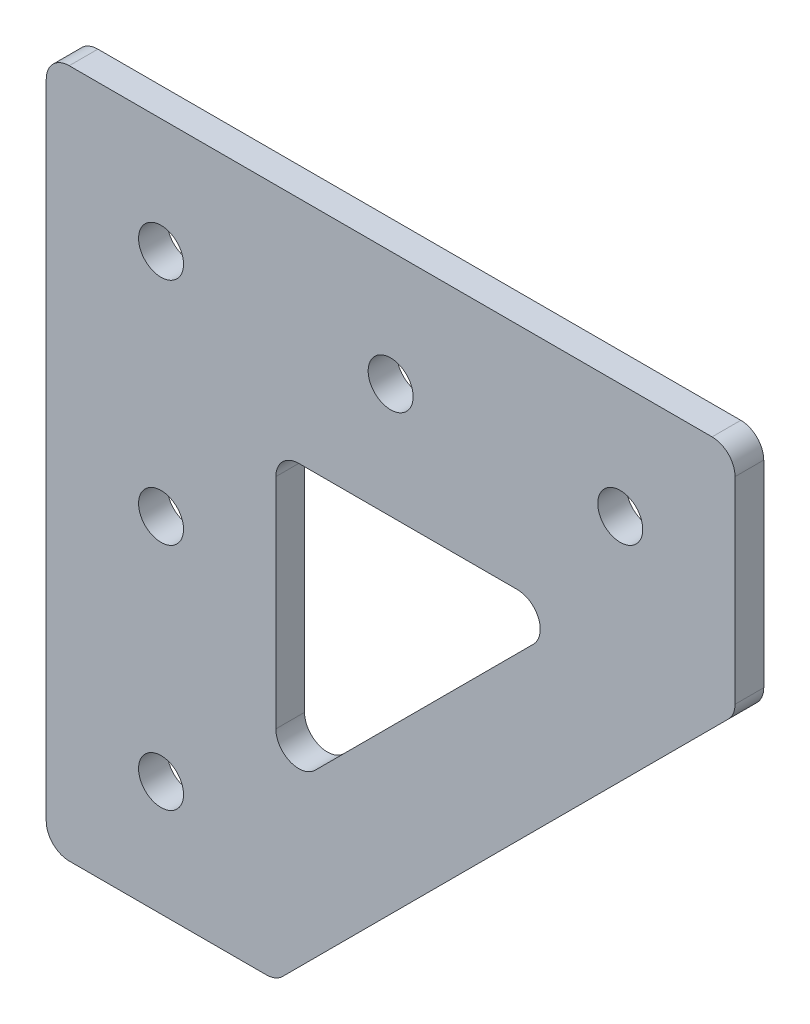
ISO-10303-21;
HEADER;
FILE_DESCRIPTION(('STEP AP214'),'2;1');
FILE_NAME('part.step','',(''),(''),'','','');
FILE_SCHEMA(('AUTOMOTIVE_DESIGN { 1 0 10303 214 1 1 1 1 }'));
ENDSEC;
DATA;
#1=APPLICATION_CONTEXT('core data for automotive mechanical design processes');
#2=APPLICATION_PROTOCOL_DEFINITION('international standard','automotive_design',2000,#1);
#3=PRODUCT_CONTEXT('',#1,'mechanical');
#4=PRODUCT('Part','Part','',(#3));
#5=PRODUCT_RELATED_PRODUCT_CATEGORY('part','',(#4));
#6=PRODUCT_DEFINITION_FORMATION('','',#4);
#7=PRODUCT_DEFINITION_CONTEXT('part definition',#1,'design');
#8=PRODUCT_DEFINITION('design','',#6,#7);
#9=PRODUCT_DEFINITION_SHAPE('','',#8);
#10=(LENGTH_UNIT() NAMED_UNIT(*) SI_UNIT(.MILLI.,.METRE.));
#11=(NAMED_UNIT(*) PLANE_ANGLE_UNIT() SI_UNIT($,.RADIAN.));
#12=(NAMED_UNIT(*) SI_UNIT($,.STERADIAN.) SOLID_ANGLE_UNIT());
#13=UNCERTAINTY_MEASURE_WITH_UNIT(LENGTH_MEASURE(1.E-05),#10,'distance_accuracy_value','');
#14=(GEOMETRIC_REPRESENTATION_CONTEXT(3) GLOBAL_UNCERTAINTY_ASSIGNED_CONTEXT((#13)) GLOBAL_UNIT_ASSIGNED_CONTEXT((#10,
#11,#12)) REPRESENTATION_CONTEXT('',''));
#15=CARTESIAN_POINT('',(0.,0.,0.));
#16=DIRECTION('',(0.,0.,1.));
#17=DIRECTION('',(1.,0.,0.));
#18=AXIS2_PLACEMENT_3D('',#15,#16,#17);
#19=CARTESIAN_POINT('',(0.,50.8,-3.175));
#20=DIRECTION('',(0.,1.,0.));
#21=DIRECTION('',(-1.,0.,0.));
#22=AXIS2_PLACEMENT_3D('',#19,#20,#21);
#23=PLANE('',#22);
#24=DIRECTION('',(-1.,0.,0.));
#25=VECTOR('',#24,1.);
#26=CARTESIAN_POINT('',(0.,50.8,-3.175));
#27=LINE('',#26,#25);
#28=CARTESIAN_POINT('',(52.107385309434,50.8,-3.175));
#29=VERTEX_POINT('',#28);
#30=CARTESIAN_POINT('',(27.94,50.8,-3.175));
#31=VERTEX_POINT('',#30);
#32=EDGE_CURVE('E172',#29,#31,#27,.T.);
#33=ORIENTED_EDGE('',*,*,#32,.F.);
#34=DIRECTION('',(0.,0.,1.));
#35=VECTOR('',#34,1.);
#36=CARTESIAN_POINT('',(52.107385309434,50.8,-3.175));
#37=LINE('',#36,#35);
#38=CARTESIAN_POINT('',(52.107385309434,50.8,0.));
#39=VERTEX_POINT('',#38);
#40=EDGE_CURVE('E157',#29,#39,#37,.T.);
#41=ORIENTED_EDGE('',*,*,#40,.T.);
#42=DIRECTION('',(-1.,0.,0.));
#43=VECTOR('',#42,1.);
#44=CARTESIAN_POINT('',(0.,50.8,0.));
#45=LINE('',#44,#43);
#46=CARTESIAN_POINT('',(27.94,50.8,0.));
#47=VERTEX_POINT('',#46);
#48=EDGE_CURVE('E169',#39,#47,#45,.T.);
#49=ORIENTED_EDGE('',*,*,#48,.T.);
#50=DIRECTION('',(0.,0.,1.));
#51=VECTOR('',#50,1.);
#52=CARTESIAN_POINT('',(27.94,50.8,-3.175));
#53=LINE('',#52,#51);
#54=EDGE_CURVE('E174',#47,#31,#53,.F.);
#55=ORIENTED_EDGE('',*,*,#54,.T.);
#56=EDGE_LOOP('',(#33,#41,#49,#55));
#57=FACE_BOUND('',#56,.T.);
#58=ADVANCED_FACE('F39',(#57),#23,.F.);
#59=CARTESIAN_POINT('',(25.4,0.,-3.175));
#60=DIRECTION('',(-1.,0.,0.));
#61=DIRECTION('',(0.,-1.,0.));
#62=AXIS2_PLACEMENT_3D('',#59,#60,#61);
#63=PLANE('',#62);
#64=DIRECTION('',(0.,-1.,0.));
#65=VECTOR('',#64,1.);
#66=CARTESIAN_POINT('',(25.4,0.,0.));
#67=LINE('',#66,#65);
#68=CARTESIAN_POINT('',(25.4,48.26,0.));
#69=VERTEX_POINT('',#68);
#70=CARTESIAN_POINT('',(25.4,24.092614690566,0.));
#71=VERTEX_POINT('',#70);
#72=EDGE_CURVE('E181',#69,#71,#67,.T.);
#73=ORIENTED_EDGE('',*,*,#72,.T.);
#74=DIRECTION('',(0.,0.,1.));
#75=VECTOR('',#74,1.);
#76=CARTESIAN_POINT('',(25.4,24.092614690566,-3.175));
#77=LINE('',#76,#75);
#78=CARTESIAN_POINT('',(25.4,24.092614690566,-3.175));
#79=VERTEX_POINT('',#78);
#80=EDGE_CURVE('E199',#71,#79,#77,.F.);
#81=ORIENTED_EDGE('',*,*,#80,.T.);
#82=DIRECTION('',(0.,-1.,0.));
#83=VECTOR('',#82,1.);
#84=CARTESIAN_POINT('',(25.4,0.,-3.175));
#85=LINE('',#84,#83);
#86=CARTESIAN_POINT('',(25.4,48.26,-3.175));
#87=VERTEX_POINT('',#86);
#88=EDGE_CURVE('E191',#87,#79,#85,.T.);
#89=ORIENTED_EDGE('',*,*,#88,.F.);
#90=DIRECTION('',(0.,0.,1.));
#91=VECTOR('',#90,1.);
#92=CARTESIAN_POINT('',(25.4,48.26,0.));
#93=LINE('',#92,#91);
#94=EDGE_CURVE('E196',#87,#69,#93,.T.);
#95=ORIENTED_EDGE('',*,*,#94,.T.);
#96=EDGE_LOOP('',(#73,#81,#89,#95));
#97=FACE_BOUND('',#96,.T.);
#98=ADVANCED_FACE('F263',(#97),#63,.F.);
#99=CARTESIAN_POINT('',(0.,0.,-3.175));
#100=DIRECTION('',(0.,1.,0.));
#101=DIRECTION('',(-1.,0.,0.));
#102=AXIS2_PLACEMENT_3D('',#99,#100,#101);
#103=PLANE('',#102);
#104=DIRECTION('',(-1.,0.,0.));
#105=VECTOR('',#104,1.);
#106=CARTESIAN_POINT('',(0.,0.,-3.175));
#107=LINE('',#106,#105);
#108=CARTESIAN_POINT('',(24.3478975515723,0.,-3.175));
#109=VERTEX_POINT('',#108);
#110=CARTESIAN_POINT('',(2.54,0.,-3.175));
#111=VERTEX_POINT('',#110);
#112=EDGE_CURVE('E190',#109,#111,#107,.T.);
#113=ORIENTED_EDGE('',*,*,#112,.F.);
#114=DIRECTION('',(0.,0.,1.));
#115=VECTOR('',#114,1.);
#116=CARTESIAN_POINT('',(24.3478975515723,0.,0.));
#117=LINE('',#116,#115);
#118=CARTESIAN_POINT('',(24.3478975515723,0.,0.));
#119=VERTEX_POINT('',#118);
#120=EDGE_CURVE('E203',#109,#119,#117,.T.);
#121=ORIENTED_EDGE('',*,*,#120,.T.);
#122=DIRECTION('',(-1.,0.,0.));
#123=VECTOR('',#122,1.);
#124=CARTESIAN_POINT('',(0.,0.,0.));
#125=LINE('',#124,#123);
#126=CARTESIAN_POINT('',(2.54,0.,0.));
#127=VERTEX_POINT('',#126);
#128=EDGE_CURVE('E276',#119,#127,#125,.T.);
#129=ORIENTED_EDGE('',*,*,#128,.T.);
#130=DIRECTION('',(0.,0.,1.));
#131=VECTOR('',#130,1.);
#132=CARTESIAN_POINT('',(2.54,0.,-3.175));
#133=LINE('',#132,#131);
#134=EDGE_CURVE('E201',#127,#111,#133,.F.);
#135=ORIENTED_EDGE('',*,*,#134,.T.);
#136=EDGE_LOOP('',(#113,#121,#129,#135));
#137=FACE_BOUND('',#136,.T.);
#138=ADVANCED_FACE('F330',(#137),#103,.F.);
#139=CARTESIAN_POINT('',(0.,0.,-3.175));
#140=DIRECTION('',(1.,0.,0.));
#141=DIRECTION('',(0.,0.,-1.));
#142=AXIS2_PLACEMENT_3D('',#139,#140,#141);
#143=PLANE('',#142);
#144=DIRECTION('',(0.,1.,0.));
#145=VECTOR('',#144,1.);
#146=CARTESIAN_POINT('',(0.,0.,-3.175));
#147=LINE('',#146,#145);
#148=CARTESIAN_POINT('',(0.,2.54,-3.175));
#149=VERTEX_POINT('',#148);
#150=CARTESIAN_POINT('',(0.,73.66,-3.175));
#151=VERTEX_POINT('',#150);
#152=EDGE_CURVE('E268',#149,#151,#147,.T.);
#153=ORIENTED_EDGE('',*,*,#152,.F.);
#154=DIRECTION('',(0.,0.,1.));
#155=VECTOR('',#154,1.);
#156=CARTESIAN_POINT('',(0.,2.54,-3.175));
#157=LINE('',#156,#155);
#158=CARTESIAN_POINT('',(0.,2.54,0.));
#159=VERTEX_POINT('',#158);
#160=EDGE_CURVE('E164',#149,#159,#157,.T.);
#161=ORIENTED_EDGE('',*,*,#160,.T.);
#162=DIRECTION('',(0.,1.,0.));
#163=VECTOR('',#162,1.);
#164=CARTESIAN_POINT('',(0.,0.,0.));
#165=LINE('',#164,#163);
#166=CARTESIAN_POINT('',(0.,73.66,0.));
#167=VERTEX_POINT('',#166);
#168=EDGE_CURVE('E179',#159,#167,#165,.T.);
#169=ORIENTED_EDGE('',*,*,#168,.T.);
#170=DIRECTION('',(0.,0.,1.));
#171=VECTOR('',#170,1.);
#172=CARTESIAN_POINT('',(0.,73.66,-3.175));
#173=LINE('',#172,#171);
#174=EDGE_CURVE('E239',#167,#151,#173,.F.);
#175=ORIENTED_EDGE('',*,*,#174,.T.);
#176=EDGE_LOOP('',(#153,#161,#169,#175));
#177=FACE_BOUND('',#176,.T.);
#178=ADVANCED_FACE('F322',(#177),#143,.F.);
#179=CARTESIAN_POINT('',(0.,76.2,-3.175));
#180=DIRECTION('',(0.,-1.,0.));
#181=DIRECTION('',(0.,0.,-1.));
#182=AXIS2_PLACEMENT_3D('',#179,#180,#181);
#183=PLANE('',#182);
#184=DIRECTION('',(1.,0.,0.));
#185=VECTOR('',#184,1.);
#186=CARTESIAN_POINT('',(0.,76.2,0.));
#187=LINE('',#186,#185);
#188=CARTESIAN_POINT('',(2.54,76.2,0.));
#189=VERTEX_POINT('',#188);
#190=CARTESIAN_POINT('',(73.66,76.2,0.));
#191=VERTEX_POINT('',#190);
#192=EDGE_CURVE('E184',#189,#191,#187,.T.);
#193=ORIENTED_EDGE('',*,*,#192,.T.);
#194=DIRECTION('',(0.,0.,1.));
#195=VECTOR('',#194,1.);
#196=CARTESIAN_POINT('',(73.66,76.2,-3.175));
#197=LINE('',#196,#195);
#198=CARTESIAN_POINT('',(73.66,76.2,-3.175));
#199=VERTEX_POINT('',#198);
#200=EDGE_CURVE('E237',#191,#199,#197,.F.);
#201=ORIENTED_EDGE('',*,*,#200,.T.);
#202=DIRECTION('',(1.,0.,0.));
#203=VECTOR('',#202,1.);
#204=CARTESIAN_POINT('',(0.,76.2,-3.175));
#205=LINE('',#204,#203);
#206=CARTESIAN_POINT('',(2.54,76.2,-3.175));
#207=VERTEX_POINT('',#206);
#208=EDGE_CURVE('E271',#207,#199,#205,.T.);
#209=ORIENTED_EDGE('',*,*,#208,.F.);
#210=DIRECTION('',(0.,0.,1.));
#211=VECTOR('',#210,1.);
#212=CARTESIAN_POINT('',(2.54,76.2,-3.175));
#213=LINE('',#212,#211);
#214=EDGE_CURVE('E234',#207,#189,#213,.T.);
#215=ORIENTED_EDGE('',*,*,#214,.T.);
#216=EDGE_LOOP('',(#193,#201,#209,#215));
#217=FACE_BOUND('',#216,.T.);
#218=ADVANCED_FACE('F288',(#217),#183,.F.);
#219=CARTESIAN_POINT('',(76.2,0.,-3.175));
#220=DIRECTION('',(-1.,0.,0.));
#221=DIRECTION('',(0.,0.,1.));
#222=AXIS2_PLACEMENT_3D('',#219,#220,#221);
#223=PLANE('',#222);
#224=DIRECTION('',(0.,-1.,0.));
#225=VECTOR('',#224,1.);
#226=CARTESIAN_POINT('',(76.2,0.,0.));
#227=LINE('',#226,#225);
#228=CARTESIAN_POINT('',(76.2,73.66,0.));
#229=VERTEX_POINT('',#228);
#230=CARTESIAN_POINT('',(76.2,51.8521024484277,0.));
#231=VERTEX_POINT('',#230);
#232=EDGE_CURVE('E283',#229,#231,#227,.T.);
#233=ORIENTED_EDGE('',*,*,#232,.T.);
#234=DIRECTION('',(0.,0.,1.));
#235=VECTOR('',#234,1.);
#236=CARTESIAN_POINT('',(76.2,51.8521024484277,-3.175));
#237=LINE('',#236,#235);
#238=CARTESIAN_POINT('',(76.2,51.8521024484277,-3.175));
#239=VERTEX_POINT('',#238);
#240=EDGE_CURVE('E54',#231,#239,#237,.F.);
#241=ORIENTED_EDGE('',*,*,#240,.T.);
#242=DIRECTION('',(0.,-1.,0.));
#243=VECTOR('',#242,1.);
#244=CARTESIAN_POINT('',(76.2,0.,-3.175));
#245=LINE('',#244,#243);
#246=CARTESIAN_POINT('',(76.2,73.66,-3.175));
#247=VERTEX_POINT('',#246);
#248=EDGE_CURVE('E297',#247,#239,#245,.T.);
#249=ORIENTED_EDGE('',*,*,#248,.F.);
#250=DIRECTION('',(0.,0.,1.));
#251=VECTOR('',#250,1.);
#252=CARTESIAN_POINT('',(76.2,73.66,-3.175));
#253=LINE('',#252,#251);
#254=EDGE_CURVE('E230',#247,#229,#253,.T.);
#255=ORIENTED_EDGE('',*,*,#254,.T.);
#256=EDGE_LOOP('',(#233,#241,#249,#255));
#257=FACE_BOUND('',#256,.T.);
#258=ADVANCED_FACE('F296',(#257),#223,.F.);
#259=CARTESIAN_POINT('',(12.7,-12.7,-3.175));
#260=DIRECTION('',(0.707106781186548,-0.707106781186548,0.));
#261=DIRECTION('',(0.707106781186548,0.707106781186548,0.));
#262=AXIS2_PLACEMENT_3D('',#259,#260,#261);
#263=PLANE('',#262);
#264=DIRECTION('',(0.707106781186548,0.707106781186548,0.));
#265=VECTOR('',#264,1.);
#266=CARTESIAN_POINT('',(12.7,-12.7,0.));
#267=LINE('',#266,#265);
#268=CARTESIAN_POINT('',(26.1439487757862,0.743948775786171,0.));
#269=VERTEX_POINT('',#268);
#270=CARTESIAN_POINT('',(75.4560512242138,50.0560512242138,0.));
#271=VERTEX_POINT('',#270);
#272=EDGE_CURVE('E279',#269,#271,#267,.T.);
#273=ORIENTED_EDGE('',*,*,#272,.F.);
#274=DIRECTION('',(0.,0.,1.));
#275=VECTOR('',#274,1.);
#276=CARTESIAN_POINT('',(26.1439487757862,0.743948775786169,-3.175));
#277=LINE('',#276,#275);
#278=CARTESIAN_POINT('',(26.1439487757862,0.743948775786171,-3.175));
#279=VERTEX_POINT('',#278);
#280=EDGE_CURVE('E219',#269,#279,#277,.F.);
#281=ORIENTED_EDGE('',*,*,#280,.T.);
#282=DIRECTION('',(0.707106781186548,0.707106781186548,0.));
#283=VECTOR('',#282,1.);
#284=CARTESIAN_POINT('',(12.7,-12.7,-3.175));
#285=LINE('',#284,#283);
#286=CARTESIAN_POINT('',(75.4560512242138,50.0560512242138,-3.175));
#287=VERTEX_POINT('',#286);
#288=EDGE_CURVE('E309',#279,#287,#285,.T.);
#289=ORIENTED_EDGE('',*,*,#288,.T.);
#290=DIRECTION('',(0.,0.,1.));
#291=VECTOR('',#290,1.);
#292=CARTESIAN_POINT('',(75.4560512242138,50.0560512242138,0.));
#293=LINE('',#292,#291);
#294=EDGE_CURVE('E216',#287,#271,#293,.T.);
#295=ORIENTED_EDGE('',*,*,#294,.T.);
#296=EDGE_LOOP('',(#273,#281,#289,#295));
#297=FACE_BOUND('',#296,.T.);
#298=ADVANCED_FACE('F306',(#297),#263,.T.);
#299=CARTESIAN_POINT('',(3.71974387893086,-3.71974387893086,-3.175));
#300=DIRECTION('',(-0.707106781186548,0.707106781186547,0.));
#301=DIRECTION('',(-0.707106781186547,-0.707106781186548,0.));
#302=AXIS2_PLACEMENT_3D('',#299,#300,#301);
#303=PLANE('',#302);
#304=DIRECTION('',(-0.707106781186547,-0.707106781186548,0.));
#305=VECTOR('',#304,1.);
#306=CARTESIAN_POINT('',(3.71974387893086,-3.71974387893086,0.));
#307=LINE('',#306,#305);
#308=CARTESIAN_POINT('',(53.9034365336479,46.4639487757862,0.));
#309=VERTEX_POINT('',#308);
#310=CARTESIAN_POINT('',(29.7360512242138,22.2965634663521,0.));
#311=VERTEX_POINT('',#310);
#312=EDGE_CURVE('E178',#309,#311,#307,.T.);
#313=ORIENTED_EDGE('',*,*,#312,.F.);
#314=DIRECTION('',(0.,0.,1.));
#315=VECTOR('',#314,1.);
#316=CARTESIAN_POINT('',(53.9034365336479,46.4639487757862,-3.175));
#317=LINE('',#316,#315);
#318=CARTESIAN_POINT('',(53.9034365336479,46.4639487757862,-3.175));
#319=VERTEX_POINT('',#318);
#320=EDGE_CURVE('E158',#309,#319,#317,.F.);
#321=ORIENTED_EDGE('',*,*,#320,.T.);
#322=DIRECTION('',(-0.707106781186547,-0.707106781186548,0.));
#323=VECTOR('',#322,1.);
#324=CARTESIAN_POINT('',(3.71974387893086,-3.71974387893086,-3.175));
#325=LINE('',#324,#323);
#326=CARTESIAN_POINT('',(29.7360512242138,22.2965634663521,-3.175));
#327=VERTEX_POINT('',#326);
#328=EDGE_CURVE('E253',#319,#327,#325,.T.);
#329=ORIENTED_EDGE('',*,*,#328,.T.);
#330=DIRECTION('',(0.,0.,1.));
#331=VECTOR('',#330,1.);
#332=CARTESIAN_POINT('',(29.7360512242138,22.2965634663521,-3.175));
#333=LINE('',#332,#331);
#334=EDGE_CURVE('E173',#327,#311,#333,.T.);
#335=ORIENTED_EDGE('',*,*,#334,.T.);
#336=EDGE_LOOP('',(#313,#321,#329,#335));
#337=FACE_BOUND('',#336,.T.);
#338=ADVANCED_FACE('F259',(#337),#303,.T.);
#339=CARTESIAN_POINT('',(0.,0.,-3.175));
#340=DIRECTION('',(0.,0.,1.));
#341=DIRECTION('',(1.,0.,0.));
#342=AXIS2_PLACEMENT_3D('',#339,#340,#341);
#343=PLANE('',#342);
#344=CARTESIAN_POINT('',(12.7,12.7,-3.175));
#345=DIRECTION('',(0.,0.,1.));
#346=DIRECTION('',(1.,0.,0.));
#347=AXIS2_PLACEMENT_3D('',#344,#345,#346);
#348=CIRCLE('',#347,2.4892);
#349=CARTESIAN_POINT('',(15.1892,12.7,-3.175));
#350=VERTEX_POINT('',#349);
#351=EDGE_CURVE('E526',#350,#350,#348,.T.);
#352=ORIENTED_EDGE('',*,*,#351,.T.);
#353=EDGE_LOOP('',(#352));
#354=FACE_BOUND('',#353,.T.);
#355=CARTESIAN_POINT('',(12.7,38.1,-3.175));
#356=DIRECTION('',(0.,0.,1.));
#357=DIRECTION('',(1.,0.,0.));
#358=AXIS2_PLACEMENT_3D('',#355,#356,#357);
#359=CIRCLE('',#358,2.4892);
#360=CARTESIAN_POINT('',(15.1892,38.1,-3.175));
#361=VERTEX_POINT('',#360);
#362=EDGE_CURVE('E530',#361,#361,#359,.T.);
#363=ORIENTED_EDGE('',*,*,#362,.T.);
#364=EDGE_LOOP('',(#363));
#365=FACE_BOUND('',#364,.T.);
#366=CARTESIAN_POINT('',(63.5,63.5,-3.175));
#367=DIRECTION('',(0.,0.,1.));
#368=DIRECTION('',(1.,0.,0.));
#369=AXIS2_PLACEMENT_3D('',#366,#367,#368);
#370=CIRCLE('',#369,2.4892);
#371=CARTESIAN_POINT('',(65.9892,63.5,-3.175));
#372=VERTEX_POINT('',#371);
#373=EDGE_CURVE('E534',#372,#372,#370,.T.);
#374=ORIENTED_EDGE('',*,*,#373,.T.);
#375=EDGE_LOOP('',(#374));
#376=FACE_BOUND('',#375,.T.);
#377=CARTESIAN_POINT('',(38.1,63.5,-3.175));
#378=DIRECTION('',(0.,0.,1.));
#379=DIRECTION('',(1.,0.,0.));
#380=AXIS2_PLACEMENT_3D('',#377,#378,#379);
#381=CIRCLE('',#380,2.4892);
#382=CARTESIAN_POINT('',(40.5892,63.5,-3.175));
#383=VERTEX_POINT('',#382);
#384=EDGE_CURVE('E538',#383,#383,#381,.T.);
#385=ORIENTED_EDGE('',*,*,#384,.T.);
#386=EDGE_LOOP('',(#385));
#387=FACE_BOUND('',#386,.T.);
#388=CARTESIAN_POINT('',(12.7,63.5,-3.175));
#389=DIRECTION('',(0.,0.,1.));
#390=DIRECTION('',(1.,0.,0.));
#391=AXIS2_PLACEMENT_3D('',#388,#389,#390);
#392=CIRCLE('',#391,2.4892);
#393=CARTESIAN_POINT('',(15.1892,63.5,-3.175));
#394=VERTEX_POINT('',#393);
#395=EDGE_CURVE('E280',#394,#394,#392,.T.);
#396=ORIENTED_EDGE('',*,*,#395,.T.);
#397=EDGE_LOOP('',(#396));
#398=FACE_BOUND('',#397,.T.);
#399=ORIENTED_EDGE('',*,*,#288,.F.);
#400=CARTESIAN_POINT('',(24.3478975515723,2.54,-3.175));
#401=DIRECTION('',(0.,0.,1.));
#402=DIRECTION('',(1.,0.,0.));
#403=AXIS2_PLACEMENT_3D('',#400,#401,#402);
#404=CIRCLE('',#403,2.54);
#405=EDGE_CURVE('E228',#279,#109,#404,.F.);
#406=ORIENTED_EDGE('',*,*,#405,.T.);
#407=ORIENTED_EDGE('',*,*,#112,.T.);
#408=CARTESIAN_POINT('',(2.54,2.54,-3.175));
#409=DIRECTION('',(0.,0.,1.));
#410=DIRECTION('',(1.,0.,0.));
#411=AXIS2_PLACEMENT_3D('',#408,#409,#410);
#412=CIRCLE('',#411,2.54);
#413=EDGE_CURVE('E223',#111,#149,#412,.F.);
#414=ORIENTED_EDGE('',*,*,#413,.T.);
#415=ORIENTED_EDGE('',*,*,#152,.T.);
#416=CARTESIAN_POINT('',(2.54,73.66,-3.175));
#417=DIRECTION('',(0.,0.,1.));
#418=DIRECTION('',(1.,0.,0.));
#419=AXIS2_PLACEMENT_3D('',#416,#417,#418);
#420=CIRCLE('',#419,2.54);
#421=EDGE_CURVE('E221',#151,#207,#420,.F.);
#422=ORIENTED_EDGE('',*,*,#421,.T.);
#423=ORIENTED_EDGE('',*,*,#208,.T.);
#424=CARTESIAN_POINT('',(73.66,73.66,-3.175));
#425=DIRECTION('',(0.,0.,1.));
#426=DIRECTION('',(1.,0.,0.));
#427=AXIS2_PLACEMENT_3D('',#424,#425,#426);
#428=CIRCLE('',#427,2.54);
#429=EDGE_CURVE('E61',#199,#247,#428,.F.);
#430=ORIENTED_EDGE('',*,*,#429,.T.);
#431=ORIENTED_EDGE('',*,*,#248,.T.);
#432=CARTESIAN_POINT('',(73.66,51.8521024484277,-3.175));
#433=DIRECTION('',(0.,0.,1.));
#434=DIRECTION('',(1.,0.,0.));
#435=AXIS2_PLACEMENT_3D('',#432,#433,#434);
#436=CIRCLE('',#435,2.54);
#437=EDGE_CURVE('E226',#239,#287,#436,.F.);
#438=ORIENTED_EDGE('',*,*,#437,.T.);
#439=EDGE_LOOP('',(#399,#406,#407,#414,#415,#422,#423,#430,#431,#438));
#440=FACE_BOUND('',#439,.T.);
#441=ORIENTED_EDGE('',*,*,#328,.F.);
#442=CARTESIAN_POINT('',(52.107385309434,48.26,-3.175));
#443=DIRECTION('',(0.,0.,1.));
#444=DIRECTION('',(1.,0.,0.));
#445=AXIS2_PLACEMENT_3D('',#442,#443,#444);
#446=CIRCLE('',#445,2.54);
#447=EDGE_CURVE('E163',#319,#29,#446,.T.);
#448=ORIENTED_EDGE('',*,*,#447,.T.);
#449=ORIENTED_EDGE('',*,*,#32,.T.);
#450=CARTESIAN_POINT('',(27.94,48.26,-3.175));
#451=DIRECTION('',(0.,0.,1.));
#452=DIRECTION('',(1.,0.,0.));
#453=AXIS2_PLACEMENT_3D('',#450,#451,#452);
#454=CIRCLE('',#453,2.54);
#455=EDGE_CURVE('E11',#31,#87,#454,.T.);
#456=ORIENTED_EDGE('',*,*,#455,.T.);
#457=ORIENTED_EDGE('',*,*,#88,.T.);
#458=CARTESIAN_POINT('',(27.94,24.092614690566,-3.175));
#459=DIRECTION('',(0.,0.,1.));
#460=DIRECTION('',(1.,0.,0.));
#461=AXIS2_PLACEMENT_3D('',#458,#459,#460);
#462=CIRCLE('',#461,2.54);
#463=EDGE_CURVE('E246',#79,#327,#462,.T.);
#464=ORIENTED_EDGE('',*,*,#463,.T.);
#465=EDGE_LOOP('',(#441,#448,#449,#456,#457,#464));
#466=FACE_BOUND('',#465,.T.);
#467=ADVANCED_FACE('F252',(#354,#365,#376,#387,#398,#440,#466),#343,.F.);
#468=CARTESIAN_POINT('',(0.,0.,0.));
#469=DIRECTION('',(0.,0.,1.));
#470=DIRECTION('',(1.,0.,0.));
#471=AXIS2_PLACEMENT_3D('',#468,#469,#470);
#472=PLANE('',#471);
#473=CARTESIAN_POINT('',(12.7,12.7,0.));
#474=DIRECTION('',(0.,0.,1.));
#475=DIRECTION('',(1.,0.,0.));
#476=AXIS2_PLACEMENT_3D('',#473,#474,#475);
#477=CIRCLE('',#476,2.4892);
#478=CARTESIAN_POINT('',(15.1892,12.7,0.));
#479=VERTEX_POINT('',#478);
#480=EDGE_CURVE('E547',#479,#479,#477,.T.);
#481=ORIENTED_EDGE('',*,*,#480,.F.);
#482=EDGE_LOOP('',(#481));
#483=FACE_BOUND('',#482,.T.);
#484=CARTESIAN_POINT('',(12.7,38.1,0.));
#485=DIRECTION('',(0.,0.,1.));
#486=DIRECTION('',(1.,0.,0.));
#487=AXIS2_PLACEMENT_3D('',#484,#485,#486);
#488=CIRCLE('',#487,2.4892);
#489=CARTESIAN_POINT('',(15.1892,38.1,0.));
#490=VERTEX_POINT('',#489);
#491=EDGE_CURVE('E551',#490,#490,#488,.T.);
#492=ORIENTED_EDGE('',*,*,#491,.F.);
#493=EDGE_LOOP('',(#492));
#494=FACE_BOUND('',#493,.T.);
#495=CARTESIAN_POINT('',(63.5,63.5,0.));
#496=DIRECTION('',(0.,0.,1.));
#497=DIRECTION('',(1.,0.,0.));
#498=AXIS2_PLACEMENT_3D('',#495,#496,#497);
#499=CIRCLE('',#498,2.4892);
#500=CARTESIAN_POINT('',(65.9892,63.5,0.));
#501=VERTEX_POINT('',#500);
#502=EDGE_CURVE('E555',#501,#501,#499,.T.);
#503=ORIENTED_EDGE('',*,*,#502,.F.);
#504=EDGE_LOOP('',(#503));
#505=FACE_BOUND('',#504,.T.);
#506=CARTESIAN_POINT('',(38.1,63.5,0.));
#507=DIRECTION('',(0.,0.,1.));
#508=DIRECTION('',(1.,0.,0.));
#509=AXIS2_PLACEMENT_3D('',#506,#507,#508);
#510=CIRCLE('',#509,2.4892);
#511=CARTESIAN_POINT('',(40.5892,63.5,0.));
#512=VERTEX_POINT('',#511);
#513=EDGE_CURVE('E544',#512,#512,#510,.T.);
#514=ORIENTED_EDGE('',*,*,#513,.F.);
#515=EDGE_LOOP('',(#514));
#516=FACE_BOUND('',#515,.T.);
#517=CARTESIAN_POINT('',(12.7,63.5,0.));
#518=DIRECTION('',(0.,0.,1.));
#519=DIRECTION('',(1.,0.,0.));
#520=AXIS2_PLACEMENT_3D('',#517,#518,#519);
#521=CIRCLE('',#520,2.4892);
#522=CARTESIAN_POINT('',(15.1892,63.5,0.));
#523=VERTEX_POINT('',#522);
#524=EDGE_CURVE('E541',#523,#523,#521,.T.);
#525=ORIENTED_EDGE('',*,*,#524,.F.);
#526=EDGE_LOOP('',(#525));
#527=FACE_BOUND('',#526,.T.);
#528=ORIENTED_EDGE('',*,*,#128,.F.);
#529=CARTESIAN_POINT('',(24.3478975515723,2.54,0.));
#530=DIRECTION('',(0.,0.,1.));
#531=DIRECTION('',(1.,0.,0.));
#532=AXIS2_PLACEMENT_3D('',#529,#530,#531);
#533=CIRCLE('',#532,2.54);
#534=EDGE_CURVE('E214',#119,#269,#533,.T.);
#535=ORIENTED_EDGE('',*,*,#534,.T.);
#536=ORIENTED_EDGE('',*,*,#272,.T.);
#537=CARTESIAN_POINT('',(73.66,51.8521024484277,0.));
#538=DIRECTION('',(0.,0.,1.));
#539=DIRECTION('',(1.,0.,0.));
#540=AXIS2_PLACEMENT_3D('',#537,#538,#539);
#541=CIRCLE('',#540,2.54);
#542=EDGE_CURVE('E212',#271,#231,#541,.T.);
#543=ORIENTED_EDGE('',*,*,#542,.T.);
#544=ORIENTED_EDGE('',*,*,#232,.F.);
#545=CARTESIAN_POINT('',(73.66,73.66,0.));
#546=DIRECTION('',(0.,0.,1.));
#547=DIRECTION('',(1.,0.,0.));
#548=AXIS2_PLACEMENT_3D('',#545,#546,#547);
#549=CIRCLE('',#548,2.54);
#550=EDGE_CURVE('E210',#229,#191,#549,.T.);
#551=ORIENTED_EDGE('',*,*,#550,.T.);
#552=ORIENTED_EDGE('',*,*,#192,.F.);
#553=CARTESIAN_POINT('',(2.54,73.66,0.));
#554=DIRECTION('',(0.,0.,1.));
#555=DIRECTION('',(1.,0.,0.));
#556=AXIS2_PLACEMENT_3D('',#553,#554,#555);
#557=CIRCLE('',#556,2.54);
#558=EDGE_CURVE('E206',#189,#167,#557,.T.);
#559=ORIENTED_EDGE('',*,*,#558,.T.);
#560=ORIENTED_EDGE('',*,*,#168,.F.);
#561=CARTESIAN_POINT('',(2.54,2.54,0.));
#562=DIRECTION('',(0.,0.,1.));
#563=DIRECTION('',(1.,0.,0.));
#564=AXIS2_PLACEMENT_3D('',#561,#562,#563);
#565=CIRCLE('',#564,2.54);
#566=EDGE_CURVE('E208',#159,#127,#565,.T.);
#567=ORIENTED_EDGE('',*,*,#566,.T.);
#568=EDGE_LOOP('',(#528,#535,#536,#543,#544,#551,#552,#559,#560,#567));
#569=FACE_BOUND('',#568,.T.);
#570=ORIENTED_EDGE('',*,*,#48,.F.);
#571=CARTESIAN_POINT('',(52.107385309434,48.26,0.));
#572=DIRECTION('',(0.,0.,1.));
#573=DIRECTION('',(1.,0.,0.));
#574=AXIS2_PLACEMENT_3D('',#571,#572,#573);
#575=CIRCLE('',#574,2.54);
#576=EDGE_CURVE('E153',#39,#309,#575,.F.);
#577=ORIENTED_EDGE('',*,*,#576,.T.);
#578=ORIENTED_EDGE('',*,*,#312,.T.);
#579=CARTESIAN_POINT('',(27.94,24.092614690566,0.));
#580=DIRECTION('',(0.,0.,1.));
#581=DIRECTION('',(1.,0.,0.));
#582=AXIS2_PLACEMENT_3D('',#579,#580,#581);
#583=CIRCLE('',#582,2.54);
#584=EDGE_CURVE('E244',#311,#71,#583,.F.);
#585=ORIENTED_EDGE('',*,*,#584,.T.);
#586=ORIENTED_EDGE('',*,*,#72,.F.);
#587=CARTESIAN_POINT('',(27.94,48.26,0.));
#588=DIRECTION('',(0.,0.,1.));
#589=DIRECTION('',(1.,0.,0.));
#590=AXIS2_PLACEMENT_3D('',#587,#588,#589);
#591=CIRCLE('',#590,2.54);
#592=EDGE_CURVE('E47',#69,#47,#591,.F.);
#593=ORIENTED_EDGE('',*,*,#592,.T.);
#594=EDGE_LOOP('',(#570,#577,#578,#585,#586,#593));
#595=FACE_BOUND('',#594,.T.);
#596=ADVANCED_FACE('F176',(#483,#494,#505,#516,#527,#569,#595),#472,.T.);
#597=CARTESIAN_POINT('',(12.7,63.5,-3.175));
#598=DIRECTION('',(0.,0.,1.));
#599=DIRECTION('',(1.,0.,0.));
#600=AXIS2_PLACEMENT_3D('',#597,#598,#599);
#601=CYLINDRICAL_SURFACE('',#600,2.4892);
#602=ORIENTED_EDGE('',*,*,#395,.F.);
#603=EDGE_LOOP('',(#602));
#604=FACE_BOUND('',#603,.T.);
#605=ORIENTED_EDGE('',*,*,#524,.T.);
#606=EDGE_LOOP('',(#605));
#607=FACE_BOUND('',#606,.T.);
#608=ADVANCED_FACE('F447',(#604,#607),#601,.F.);
#609=CARTESIAN_POINT('',(38.1,63.5,-3.175));
#610=DIRECTION('',(0.,0.,1.));
#611=DIRECTION('',(1.,0.,0.));
#612=AXIS2_PLACEMENT_3D('',#609,#610,#611);
#613=CYLINDRICAL_SURFACE('',#612,2.4892);
#614=ORIENTED_EDGE('',*,*,#384,.F.);
#615=EDGE_LOOP('',(#614));
#616=FACE_BOUND('',#615,.T.);
#617=ORIENTED_EDGE('',*,*,#513,.T.);
#618=EDGE_LOOP('',(#617));
#619=FACE_BOUND('',#618,.T.);
#620=ADVANCED_FACE('F438',(#616,#619),#613,.F.);
#621=CARTESIAN_POINT('',(63.5,63.5,-3.175));
#622=DIRECTION('',(0.,0.,1.));
#623=DIRECTION('',(1.,0.,0.));
#624=AXIS2_PLACEMENT_3D('',#621,#622,#623);
#625=CYLINDRICAL_SURFACE('',#624,2.4892);
#626=ORIENTED_EDGE('',*,*,#373,.F.);
#627=EDGE_LOOP('',(#626));
#628=FACE_BOUND('',#627,.T.);
#629=ORIENTED_EDGE('',*,*,#502,.T.);
#630=EDGE_LOOP('',(#629));
#631=FACE_BOUND('',#630,.T.);
#632=ADVANCED_FACE('F429',(#628,#631),#625,.F.);
#633=CARTESIAN_POINT('',(12.7,38.1,-3.175));
#634=DIRECTION('',(0.,0.,1.));
#635=DIRECTION('',(1.,0.,0.));
#636=AXIS2_PLACEMENT_3D('',#633,#634,#635);
#637=CYLINDRICAL_SURFACE('',#636,2.4892);
#638=ORIENTED_EDGE('',*,*,#362,.F.);
#639=EDGE_LOOP('',(#638));
#640=FACE_BOUND('',#639,.T.);
#641=ORIENTED_EDGE('',*,*,#491,.T.);
#642=EDGE_LOOP('',(#641));
#643=FACE_BOUND('',#642,.T.);
#644=ADVANCED_FACE('F420',(#640,#643),#637,.F.);
#645=CARTESIAN_POINT('',(12.7,12.7,-3.175));
#646=DIRECTION('',(0.,0.,1.));
#647=DIRECTION('',(1.,0.,0.));
#648=AXIS2_PLACEMENT_3D('',#645,#646,#647);
#649=CYLINDRICAL_SURFACE('',#648,2.4892);
#650=ORIENTED_EDGE('',*,*,#351,.F.);
#651=EDGE_LOOP('',(#650));
#652=FACE_BOUND('',#651,.T.);
#653=ORIENTED_EDGE('',*,*,#480,.T.);
#654=EDGE_LOOP('',(#653));
#655=FACE_BOUND('',#654,.T.);
#656=ADVANCED_FACE('F363',(#652,#655),#649,.F.);
#657=CARTESIAN_POINT('',(52.107385309434,48.26,-3.175));
#658=DIRECTION('',(0.,0.,1.));
#659=DIRECTION('',(1.,0.,0.));
#660=AXIS2_PLACEMENT_3D('',#657,#658,#659);
#661=CYLINDRICAL_SURFACE('',#660,2.54);
#662=ORIENTED_EDGE('',*,*,#447,.F.);
#663=ORIENTED_EDGE('',*,*,#320,.F.);
#664=ORIENTED_EDGE('',*,*,#576,.F.);
#665=ORIENTED_EDGE('',*,*,#40,.F.);
#666=EDGE_LOOP('',(#662,#663,#664,#665));
#667=FACE_BOUND('',#666,.T.);
#668=ADVANCED_FACE('F156',(#667),#661,.F.);
#669=CARTESIAN_POINT('',(27.94,24.092614690566,-3.175));
#670=DIRECTION('',(0.,0.,1.));
#671=DIRECTION('',(1.,0.,0.));
#672=AXIS2_PLACEMENT_3D('',#669,#670,#671);
#673=CYLINDRICAL_SURFACE('',#672,2.54);
#674=ORIENTED_EDGE('',*,*,#463,.F.);
#675=ORIENTED_EDGE('',*,*,#80,.F.);
#676=ORIENTED_EDGE('',*,*,#584,.F.);
#677=ORIENTED_EDGE('',*,*,#334,.F.);
#678=EDGE_LOOP('',(#674,#675,#676,#677));
#679=FACE_BOUND('',#678,.T.);
#680=ADVANCED_FACE('F261',(#679),#673,.F.);
#681=CARTESIAN_POINT('',(27.94,48.26,-3.175));
#682=DIRECTION('',(0.,0.,-1.));
#683=DIRECTION('',(-1.,0.,0.));
#684=AXIS2_PLACEMENT_3D('',#681,#682,#683);
#685=CYLINDRICAL_SURFACE('',#684,2.54);
#686=ORIENTED_EDGE('',*,*,#455,.F.);
#687=ORIENTED_EDGE('',*,*,#54,.F.);
#688=ORIENTED_EDGE('',*,*,#592,.F.);
#689=ORIENTED_EDGE('',*,*,#94,.F.);
#690=EDGE_LOOP('',(#686,#687,#688,#689));
#691=FACE_BOUND('',#690,.T.);
#692=ADVANCED_FACE('F267',(#691),#685,.F.);
#693=CARTESIAN_POINT('',(24.3478975515723,2.54,-3.175));
#694=DIRECTION('',(0.,0.,-1.));
#695=DIRECTION('',(-1.,0.,0.));
#696=AXIS2_PLACEMENT_3D('',#693,#694,#695);
#697=CYLINDRICAL_SURFACE('',#696,2.54);
#698=ORIENTED_EDGE('',*,*,#405,.F.);
#699=ORIENTED_EDGE('',*,*,#280,.F.);
#700=ORIENTED_EDGE('',*,*,#534,.F.);
#701=ORIENTED_EDGE('',*,*,#120,.F.);
#702=EDGE_LOOP('',(#698,#699,#700,#701));
#703=FACE_BOUND('',#702,.T.);
#704=ADVANCED_FACE('F333',(#703),#697,.T.);
#705=CARTESIAN_POINT('',(73.66,51.8521024484277,-3.175));
#706=DIRECTION('',(0.,0.,-1.));
#707=DIRECTION('',(-1.,0.,0.));
#708=AXIS2_PLACEMENT_3D('',#705,#706,#707);
#709=CYLINDRICAL_SURFACE('',#708,2.54);
#710=ORIENTED_EDGE('',*,*,#437,.F.);
#711=ORIENTED_EDGE('',*,*,#240,.F.);
#712=ORIENTED_EDGE('',*,*,#542,.F.);
#713=ORIENTED_EDGE('',*,*,#294,.F.);
#714=EDGE_LOOP('',(#710,#711,#712,#713));
#715=FACE_BOUND('',#714,.T.);
#716=ADVANCED_FACE('F303',(#715),#709,.T.);
#717=CARTESIAN_POINT('',(73.66,73.66,-3.175));
#718=DIRECTION('',(0.,0.,1.));
#719=DIRECTION('',(1.,0.,0.));
#720=AXIS2_PLACEMENT_3D('',#717,#718,#719);
#721=CYLINDRICAL_SURFACE('',#720,2.54);
#722=ORIENTED_EDGE('',*,*,#429,.F.);
#723=ORIENTED_EDGE('',*,*,#200,.F.);
#724=ORIENTED_EDGE('',*,*,#550,.F.);
#725=ORIENTED_EDGE('',*,*,#254,.F.);
#726=EDGE_LOOP('',(#722,#723,#724,#725));
#727=FACE_BOUND('',#726,.T.);
#728=ADVANCED_FACE('F293',(#727),#721,.T.);
#729=CARTESIAN_POINT('',(2.54,2.54,-3.175));
#730=DIRECTION('',(0.,0.,1.));
#731=DIRECTION('',(1.,0.,0.));
#732=AXIS2_PLACEMENT_3D('',#729,#730,#731);
#733=CYLINDRICAL_SURFACE('',#732,2.54);
#734=ORIENTED_EDGE('',*,*,#413,.F.);
#735=ORIENTED_EDGE('',*,*,#134,.F.);
#736=ORIENTED_EDGE('',*,*,#566,.F.);
#737=ORIENTED_EDGE('',*,*,#160,.F.);
#738=EDGE_LOOP('',(#734,#735,#736,#737));
#739=FACE_BOUND('',#738,.T.);
#740=ADVANCED_FACE('F326',(#739),#733,.T.);
#741=CARTESIAN_POINT('',(2.54,73.66,-3.175));
#742=DIRECTION('',(0.,0.,1.));
#743=DIRECTION('',(1.,0.,0.));
#744=AXIS2_PLACEMENT_3D('',#741,#742,#743);
#745=CYLINDRICAL_SURFACE('',#744,2.54);
#746=ORIENTED_EDGE('',*,*,#421,.F.);
#747=ORIENTED_EDGE('',*,*,#174,.F.);
#748=ORIENTED_EDGE('',*,*,#558,.F.);
#749=ORIENTED_EDGE('',*,*,#214,.F.);
#750=EDGE_LOOP('',(#746,#747,#748,#749));
#751=FACE_BOUND('',#750,.T.);
#752=ADVANCED_FACE('F41',(#751),#745,.T.);
#753=CLOSED_SHELL('',(#58,#98,#138,#178,#218,#258,#298,#338,#467,#596,#608,#620,#632,#644,#656,
#668,#680,#692,#704,#716,#728,#740,#752));
#754=MANIFOLD_SOLID_BREP('B2',#753);
#755=ADVANCED_BREP_SHAPE_REPRESENTATION('',(#18,#754),#14);
#756=SHAPE_DEFINITION_REPRESENTATION(#9,#755);
ENDSEC;
END-ISO-10303-21;
